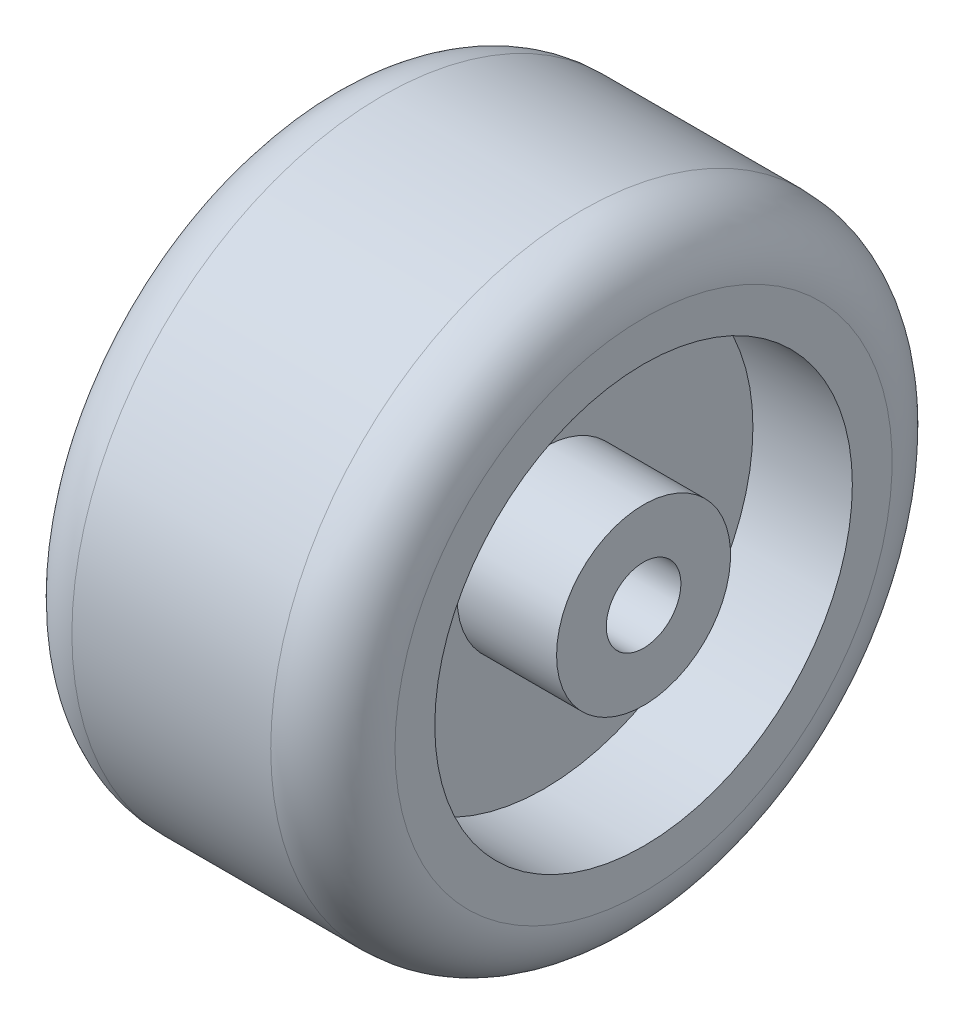
ISO-10303-21;
HEADER;
FILE_DESCRIPTION(('STEP AP214'),'2;1');
FILE_NAME('part.step','',(''),(''),'','','');
FILE_SCHEMA(('AUTOMOTIVE_DESIGN { 1 0 10303 214 1 1 1 1 }'));
ENDSEC;
DATA;
#1=APPLICATION_CONTEXT('core data for automotive mechanical design processes');
#2=APPLICATION_PROTOCOL_DEFINITION('international standard','automotive_design',2000,#1);
#3=PRODUCT_CONTEXT('',#1,'mechanical');
#4=PRODUCT('Part','Part','',(#3));
#5=PRODUCT_RELATED_PRODUCT_CATEGORY('part','',(#4));
#6=PRODUCT_DEFINITION_FORMATION('','',#4);
#7=PRODUCT_DEFINITION_CONTEXT('part definition',#1,'design');
#8=PRODUCT_DEFINITION('design','',#6,#7);
#9=PRODUCT_DEFINITION_SHAPE('','',#8);
#10=(LENGTH_UNIT() NAMED_UNIT(*) SI_UNIT(.MILLI.,.METRE.));
#11=(NAMED_UNIT(*) PLANE_ANGLE_UNIT() SI_UNIT($,.RADIAN.));
#12=(NAMED_UNIT(*) SI_UNIT($,.STERADIAN.) SOLID_ANGLE_UNIT());
#13=UNCERTAINTY_MEASURE_WITH_UNIT(LENGTH_MEASURE(1.E-05),#10,'distance_accuracy_value','');
#14=(GEOMETRIC_REPRESENTATION_CONTEXT(3) GLOBAL_UNCERTAINTY_ASSIGNED_CONTEXT((#13)) GLOBAL_UNIT_ASSIGNED_CONTEXT((#10,
#11,#12)) REPRESENTATION_CONTEXT('',''));
#15=CARTESIAN_POINT('',(0.,0.,0.));
#16=DIRECTION('',(0.,0.,1.));
#17=DIRECTION('',(1.,0.,0.));
#18=AXIS2_PLACEMENT_3D('',#15,#16,#17);
#19=CARTESIAN_POINT('',(-1000.57490717567,0.,0.));
#20=DIRECTION('',(-1.,0.,0.));
#21=DIRECTION('',(0.,0.,1.));
#22=AXIS2_PLACEMENT_3D('',#19,#20,#21);
#23=CYLINDRICAL_SURFACE('',#22,3.5);
#24=CARTESIAN_POINT('',(-4.,0.,0.));
#25=DIRECTION('',(-1.,0.,0.));
#26=DIRECTION('',(0.,0.,1.));
#27=AXIS2_PLACEMENT_3D('',#24,#25,#26);
#28=CIRCLE('',#27,3.5);
#29=CARTESIAN_POINT('',(-4.,0.,3.5));
#30=VERTEX_POINT('',#29);
#31=EDGE_CURVE('E10',#30,#30,#28,.T.);
#32=ORIENTED_EDGE('',*,*,#31,.F.);
#33=EDGE_LOOP('',(#32));
#34=FACE_BOUND('',#33,.T.);
#35=CARTESIAN_POINT('',(0.,0.,0.));
#36=DIRECTION('',(-1.,0.,0.));
#37=DIRECTION('',(0.,0.,1.));
#38=AXIS2_PLACEMENT_3D('',#35,#36,#37);
#39=CIRCLE('',#38,3.5);
#40=CARTESIAN_POINT('',(0.,0.,3.5));
#41=VERTEX_POINT('',#40);
#42=EDGE_CURVE('E78',#41,#41,#39,.T.);
#43=ORIENTED_EDGE('',*,*,#42,.T.);
#44=EDGE_LOOP('',(#43));
#45=FACE_BOUND('',#44,.T.);
#46=ADVANCED_FACE('F32',(#34,#45),#23,.T.);
#47=CARTESIAN_POINT('',(-4.,3.5,0.));
#48=DIRECTION('',(-1.,0.,0.));
#49=DIRECTION('',(0.,0.,1.));
#50=AXIS2_PLACEMENT_3D('',#47,#48,#49);
#51=PLANE('',#50);
#52=CARTESIAN_POINT('',(-4.,0.,0.));
#53=DIRECTION('',(-1.,0.,0.));
#54=DIRECTION('',(0.,0.,1.));
#55=AXIS2_PLACEMENT_3D('',#52,#53,#54);
#56=CIRCLE('',#55,8.4);
#57=CARTESIAN_POINT('',(-4.,0.,8.4));
#58=VERTEX_POINT('',#57);
#59=EDGE_CURVE('E38',#58,#58,#56,.T.);
#60=ORIENTED_EDGE('',*,*,#59,.F.);
#61=EDGE_LOOP('',(#60));
#62=FACE_BOUND('',#61,.T.);
#63=ORIENTED_EDGE('',*,*,#31,.T.);
#64=EDGE_LOOP('',(#63));
#65=FACE_BOUND('',#64,.T.);
#66=ADVANCED_FACE('F151',(#62,#65),#51,.F.);
#67=CARTESIAN_POINT('',(-1000.57490717567,0.,0.));
#68=DIRECTION('',(-1.,0.,0.));
#69=DIRECTION('',(0.,0.,1.));
#70=AXIS2_PLACEMENT_3D('',#67,#68,#69);
#71=CYLINDRICAL_SURFACE('',#70,8.4);
#72=CARTESIAN_POINT('',(0.,0.,0.));
#73=DIRECTION('',(-1.,0.,0.));
#74=DIRECTION('',(0.,0.,1.));
#75=AXIS2_PLACEMENT_3D('',#72,#73,#74);
#76=CIRCLE('',#75,8.4);
#77=CARTESIAN_POINT('',(0.,0.,8.4));
#78=VERTEX_POINT('',#77);
#79=EDGE_CURVE('E42',#78,#78,#76,.T.);
#80=ORIENTED_EDGE('',*,*,#79,.F.);
#81=EDGE_LOOP('',(#80));
#82=FACE_BOUND('',#81,.T.);
#83=ORIENTED_EDGE('',*,*,#59,.T.);
#84=EDGE_LOOP('',(#83));
#85=FACE_BOUND('',#84,.T.);
#86=ADVANCED_FACE('F146',(#82,#85),#71,.F.);
#87=CARTESIAN_POINT('',(0.,8.4,0.));
#88=DIRECTION('',(-1.,0.,0.));
#89=DIRECTION('',(0.,0.,1.));
#90=AXIS2_PLACEMENT_3D('',#87,#88,#89);
#91=PLANE('',#90);
#92=CARTESIAN_POINT('',(0.,0.,0.));
#93=DIRECTION('',(-1.,0.,0.));
#94=DIRECTION('',(0.,0.,1.));
#95=AXIS2_PLACEMENT_3D('',#92,#93,#94);
#96=CIRCLE('',#95,10.);
#97=CARTESIAN_POINT('',(0.,0.,10.));
#98=VERTEX_POINT('',#97);
#99=EDGE_CURVE('E46',#98,#98,#96,.T.);
#100=ORIENTED_EDGE('',*,*,#99,.F.);
#101=EDGE_LOOP('',(#100));
#102=FACE_BOUND('',#101,.T.);
#103=ORIENTED_EDGE('',*,*,#79,.T.);
#104=EDGE_LOOP('',(#103));
#105=FACE_BOUND('',#104,.T.);
#106=ADVANCED_FACE('F140',(#102,#105),#91,.F.);
#107=CARTESIAN_POINT('',(-2.5,0.,0.));
#108=DIRECTION('',(-1.,0.,0.));
#109=DIRECTION('',(0.,0.,1.));
#110=AXIS2_PLACEMENT_3D('',#107,#108,#109);
#111=TOROIDAL_SURFACE('',#110,10.,2.5);
#112=CARTESIAN_POINT('',(-2.49999999999995,0.,0.));
#113=DIRECTION('',(-1.,0.,0.));
#114=DIRECTION('',(0.,0.,1.));
#115=AXIS2_PLACEMENT_3D('',#112,#113,#114);
#116=CIRCLE('',#115,12.5);
#117=CARTESIAN_POINT('',(-2.49999999999995,0.,12.5));
#118=VERTEX_POINT('',#117);
#119=EDGE_CURVE('E51',#118,#118,#116,.T.);
#120=ORIENTED_EDGE('',*,*,#119,.F.);
#121=EDGE_LOOP('',(#120));
#122=FACE_BOUND('',#121,.T.);
#123=ORIENTED_EDGE('',*,*,#99,.T.);
#124=EDGE_LOOP('',(#123));
#125=FACE_BOUND('',#124,.T.);
#126=ADVANCED_FACE('F134',(#122,#125),#111,.T.);
#127=CARTESIAN_POINT('',(-1000.57490717567,0.,0.));
#128=DIRECTION('',(-1.,0.,0.));
#129=DIRECTION('',(0.,0.,1.));
#130=AXIS2_PLACEMENT_3D('',#127,#128,#129);
#131=CYLINDRICAL_SURFACE('',#130,12.5);
#132=CARTESIAN_POINT('',(-10.5,0.,0.));
#133=DIRECTION('',(-1.,0.,0.));
#134=DIRECTION('',(0.,0.,1.));
#135=AXIS2_PLACEMENT_3D('',#132,#133,#134);
#136=CIRCLE('',#135,12.5);
#137=CARTESIAN_POINT('',(-10.5,0.,12.5));
#138=VERTEX_POINT('',#137);
#139=EDGE_CURVE('E54',#138,#138,#136,.T.);
#140=ORIENTED_EDGE('',*,*,#139,.F.);
#141=EDGE_LOOP('',(#140));
#142=FACE_BOUND('',#141,.T.);
#143=ORIENTED_EDGE('',*,*,#119,.T.);
#144=EDGE_LOOP('',(#143));
#145=FACE_BOUND('',#144,.T.);
#146=ADVANCED_FACE('F128',(#142,#145),#131,.T.);
#147=CARTESIAN_POINT('',(-10.5,0.,0.));
#148=DIRECTION('',(-1.,0.,0.));
#149=DIRECTION('',(0.,0.,1.));
#150=AXIS2_PLACEMENT_3D('',#147,#148,#149);
#151=TOROIDAL_SURFACE('',#150,10.,2.5);
#152=CARTESIAN_POINT('',(-13.,0.,0.));
#153=DIRECTION('',(-1.,0.,0.));
#154=DIRECTION('',(0.,0.,1.));
#155=AXIS2_PLACEMENT_3D('',#152,#153,#154);
#156=CIRCLE('',#155,10.);
#157=CARTESIAN_POINT('',(-13.,0.,10.));
#158=VERTEX_POINT('',#157);
#159=EDGE_CURVE('E57',#158,#158,#156,.T.);
#160=ORIENTED_EDGE('',*,*,#159,.F.);
#161=EDGE_LOOP('',(#160));
#162=FACE_BOUND('',#161,.T.);
#163=ORIENTED_EDGE('',*,*,#139,.T.);
#164=EDGE_LOOP('',(#163));
#165=FACE_BOUND('',#164,.T.);
#166=ADVANCED_FACE('F122',(#162,#165),#151,.T.);
#167=CARTESIAN_POINT('',(-13.,8.4,0.));
#168=DIRECTION('',(1.,0.,0.));
#169=DIRECTION('',(0.,0.,-1.));
#170=AXIS2_PLACEMENT_3D('',#167,#168,#169);
#171=PLANE('',#170);
#172=CARTESIAN_POINT('',(-13.,0.,0.));
#173=DIRECTION('',(-1.,0.,0.));
#174=DIRECTION('',(0.,0.,1.));
#175=AXIS2_PLACEMENT_3D('',#172,#173,#174);
#176=CIRCLE('',#175,8.4);
#177=CARTESIAN_POINT('',(-13.,0.,8.4));
#178=VERTEX_POINT('',#177);
#179=EDGE_CURVE('E60',#178,#178,#176,.T.);
#180=ORIENTED_EDGE('',*,*,#179,.F.);
#181=EDGE_LOOP('',(#180));
#182=FACE_BOUND('',#181,.T.);
#183=ORIENTED_EDGE('',*,*,#159,.T.);
#184=EDGE_LOOP('',(#183));
#185=FACE_BOUND('',#184,.T.);
#186=ADVANCED_FACE('F116',(#182,#185),#171,.F.);
#187=CARTESIAN_POINT('',(-1000.57490717567,0.,0.));
#188=DIRECTION('',(-1.,0.,0.));
#189=DIRECTION('',(0.,0.,1.));
#190=AXIS2_PLACEMENT_3D('',#187,#188,#189);
#191=CYLINDRICAL_SURFACE('',#190,8.4);
#192=CARTESIAN_POINT('',(-9.00000000000001,0.,0.));
#193=DIRECTION('',(-1.,0.,0.));
#194=DIRECTION('',(0.,0.,1.));
#195=AXIS2_PLACEMENT_3D('',#192,#193,#194);
#196=CIRCLE('',#195,8.4);
#197=CARTESIAN_POINT('',(-9.00000000000001,0.,8.4));
#198=VERTEX_POINT('',#197);
#199=EDGE_CURVE('E63',#198,#198,#196,.T.);
#200=ORIENTED_EDGE('',*,*,#199,.F.);
#201=EDGE_LOOP('',(#200));
#202=FACE_BOUND('',#201,.T.);
#203=ORIENTED_EDGE('',*,*,#179,.T.);
#204=EDGE_LOOP('',(#203));
#205=FACE_BOUND('',#204,.T.);
#206=ADVANCED_FACE('F110',(#202,#205),#191,.F.);
#207=CARTESIAN_POINT('',(-9.,3.5,0.));
#208=DIRECTION('',(1.,0.,0.));
#209=DIRECTION('',(0.,0.,-1.));
#210=AXIS2_PLACEMENT_3D('',#207,#208,#209);
#211=PLANE('',#210);
#212=CARTESIAN_POINT('',(-9.00000000000001,0.,0.));
#213=DIRECTION('',(-1.,0.,0.));
#214=DIRECTION('',(0.,0.,1.));
#215=AXIS2_PLACEMENT_3D('',#212,#213,#214);
#216=CIRCLE('',#215,3.5);
#217=CARTESIAN_POINT('',(-9.00000000000001,0.,3.5));
#218=VERTEX_POINT('',#217);
#219=EDGE_CURVE('E66',#218,#218,#216,.T.);
#220=ORIENTED_EDGE('',*,*,#219,.F.);
#221=EDGE_LOOP('',(#220));
#222=FACE_BOUND('',#221,.T.);
#223=ORIENTED_EDGE('',*,*,#199,.T.);
#224=EDGE_LOOP('',(#223));
#225=FACE_BOUND('',#224,.T.);
#226=ADVANCED_FACE('F104',(#222,#225),#211,.F.);
#227=CARTESIAN_POINT('',(-1000.57490717567,0.,0.));
#228=DIRECTION('',(-1.,0.,0.));
#229=DIRECTION('',(0.,0.,1.));
#230=AXIS2_PLACEMENT_3D('',#227,#228,#229);
#231=CYLINDRICAL_SURFACE('',#230,3.5);
#232=CARTESIAN_POINT('',(-13.,0.,0.));
#233=DIRECTION('',(-1.,0.,0.));
#234=DIRECTION('',(0.,0.,1.));
#235=AXIS2_PLACEMENT_3D('',#232,#233,#234);
#236=CIRCLE('',#235,3.5);
#237=CARTESIAN_POINT('',(-13.,0.,3.5));
#238=VERTEX_POINT('',#237);
#239=EDGE_CURVE('E69',#238,#238,#236,.T.);
#240=ORIENTED_EDGE('',*,*,#239,.F.);
#241=EDGE_LOOP('',(#240));
#242=FACE_BOUND('',#241,.T.);
#243=ORIENTED_EDGE('',*,*,#219,.T.);
#244=EDGE_LOOP('',(#243));
#245=FACE_BOUND('',#244,.T.);
#246=ADVANCED_FACE('F98',(#242,#245),#231,.T.);
#247=CARTESIAN_POINT('',(-13.,1.5,0.));
#248=DIRECTION('',(1.,0.,0.));
#249=DIRECTION('',(0.,0.,-1.));
#250=AXIS2_PLACEMENT_3D('',#247,#248,#249);
#251=PLANE('',#250);
#252=CARTESIAN_POINT('',(-13.,0.,0.));
#253=DIRECTION('',(-1.,0.,0.));
#254=DIRECTION('',(0.,0.,1.));
#255=AXIS2_PLACEMENT_3D('',#252,#253,#254);
#256=CIRCLE('',#255,1.5);
#257=CARTESIAN_POINT('',(-13.,0.,1.5));
#258=VERTEX_POINT('',#257);
#259=EDGE_CURVE('E72',#258,#258,#256,.T.);
#260=ORIENTED_EDGE('',*,*,#259,.F.);
#261=EDGE_LOOP('',(#260));
#262=FACE_BOUND('',#261,.T.);
#263=ORIENTED_EDGE('',*,*,#239,.T.);
#264=EDGE_LOOP('',(#263));
#265=FACE_BOUND('',#264,.T.);
#266=ADVANCED_FACE('F92',(#262,#265),#251,.F.);
#267=CARTESIAN_POINT('',(-1000.57490717567,0.,0.));
#268=DIRECTION('',(-1.,0.,0.));
#269=DIRECTION('',(0.,0.,1.));
#270=AXIS2_PLACEMENT_3D('',#267,#268,#269);
#271=CYLINDRICAL_SURFACE('',#270,1.5);
#272=CARTESIAN_POINT('',(0.,0.,0.));
#273=DIRECTION('',(-1.,0.,0.));
#274=DIRECTION('',(0.,0.,1.));
#275=AXIS2_PLACEMENT_3D('',#272,#273,#274);
#276=CIRCLE('',#275,1.5);
#277=CARTESIAN_POINT('',(0.,0.,1.5));
#278=VERTEX_POINT('',#277);
#279=EDGE_CURVE('E75',#278,#278,#276,.T.);
#280=ORIENTED_EDGE('',*,*,#279,.F.);
#281=EDGE_LOOP('',(#280));
#282=FACE_BOUND('',#281,.T.);
#283=ORIENTED_EDGE('',*,*,#259,.T.);
#284=EDGE_LOOP('',(#283));
#285=FACE_BOUND('',#284,.T.);
#286=ADVANCED_FACE('F86',(#282,#285),#271,.F.);
#287=CARTESIAN_POINT('',(0.,1.5,0.));
#288=DIRECTION('',(-1.,0.,0.));
#289=DIRECTION('',(0.,0.,1.));
#290=AXIS2_PLACEMENT_3D('',#287,#288,#289);
#291=PLANE('',#290);
#292=ORIENTED_EDGE('',*,*,#42,.F.);
#293=EDGE_LOOP('',(#292));
#294=FACE_BOUND('',#293,.T.);
#295=ORIENTED_EDGE('',*,*,#279,.T.);
#296=EDGE_LOOP('',(#295));
#297=FACE_BOUND('',#296,.T.);
#298=ADVANCED_FACE('F83',(#294,#297),#291,.F.);
#299=CLOSED_SHELL('',(#46,#66,#86,#106,#126,#146,#166,#186,#206,#226,#246,#266,#286,#298));
#300=MANIFOLD_SOLID_BREP('B2',#299);
#301=ADVANCED_BREP_SHAPE_REPRESENTATION('',(#18,#300),#14);
#302=SHAPE_DEFINITION_REPRESENTATION(#9,#301);
ENDSEC;
END-ISO-10303-21;
